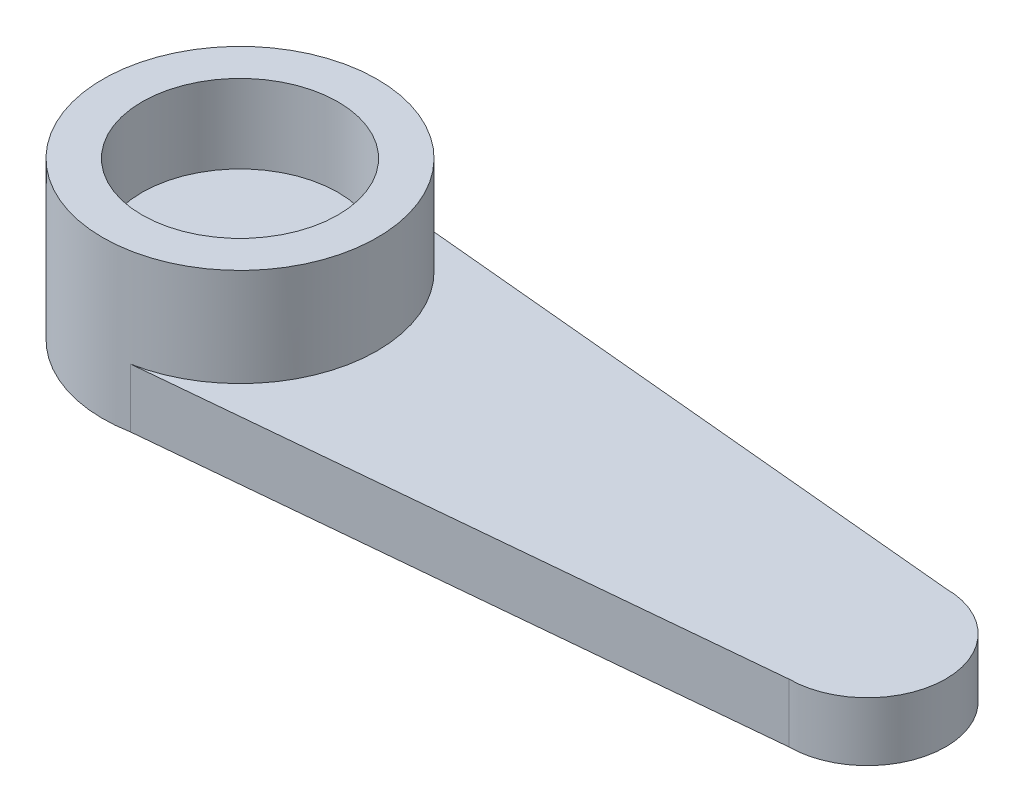
ISO-10303-21;
HEADER;
FILE_DESCRIPTION(('STEP AP214'),'2;1');
FILE_NAME('part.step','',(''),(''),'','','');
FILE_SCHEMA(('AUTOMOTIVE_DESIGN { 1 0 10303 214 1 1 1 1 }'));
ENDSEC;
DATA;
#1=APPLICATION_CONTEXT('core data for automotive mechanical design processes');
#2=APPLICATION_PROTOCOL_DEFINITION('international standard','automotive_design',2000,#1);
#3=PRODUCT_CONTEXT('',#1,'mechanical');
#4=PRODUCT('Part','Part','',(#3));
#5=PRODUCT_RELATED_PRODUCT_CATEGORY('part','',(#4));
#6=PRODUCT_DEFINITION_FORMATION('','',#4);
#7=PRODUCT_DEFINITION_CONTEXT('part definition',#1,'design');
#8=PRODUCT_DEFINITION('design','',#6,#7);
#9=PRODUCT_DEFINITION_SHAPE('','',#8);
#10=(LENGTH_UNIT() NAMED_UNIT(*) SI_UNIT(.MILLI.,.METRE.));
#11=(NAMED_UNIT(*) PLANE_ANGLE_UNIT() SI_UNIT($,.RADIAN.));
#12=(NAMED_UNIT(*) SI_UNIT($,.STERADIAN.) SOLID_ANGLE_UNIT());
#13=UNCERTAINTY_MEASURE_WITH_UNIT(LENGTH_MEASURE(1.E-05),#10,'distance_accuracy_value','');
#14=(GEOMETRIC_REPRESENTATION_CONTEXT(3) GLOBAL_UNCERTAINTY_ASSIGNED_CONTEXT((#13)) GLOBAL_UNIT_ASSIGNED_CONTEXT((#10,
#11,#12)) REPRESENTATION_CONTEXT('',''));
#15=CARTESIAN_POINT('',(0.,0.,0.));
#16=DIRECTION('',(0.,0.,1.));
#17=DIRECTION('',(1.,0.,0.));
#18=AXIS2_PLACEMENT_3D('',#15,#16,#17);
#19=CARTESIAN_POINT('',(0.,4.,0.));
#20=DIRECTION('',(0.,-1.,0.));
#21=DIRECTION('',(0.,0.,-1.));
#22=AXIS2_PLACEMENT_3D('',#19,#20,#21);
#23=CYLINDRICAL_SURFACE('',#22,3.5);
#24=CARTESIAN_POINT('',(0.,1.5,0.));
#25=DIRECTION('',(0.,1.,0.));
#26=DIRECTION('',(0.,0.,1.));
#27=AXIS2_PLACEMENT_3D('',#24,#25,#26);
#28=CIRCLE('',#27,3.5);
#29=CARTESIAN_POINT('',(0.650532429816065,1.5,3.43901258470474));
#30=VERTEX_POINT('',#29);
#31=CARTESIAN_POINT('',(0.650532429816065,1.5,-3.43901258470474));
#32=VERTEX_POINT('',#31);
#33=EDGE_CURVE('E48',#30,#32,#28,.T.);
#34=ORIENTED_EDGE('',*,*,#33,.T.);
#35=DIRECTION('',(0.,-1.,0.));
#36=VECTOR('',#35,1.);
#37=CARTESIAN_POINT('',(0.650532429816065,1.5,-3.43901258470474));
#38=LINE('',#37,#36);
#39=CARTESIAN_POINT('',(0.650532429816065,0.,-3.43901258470474));
#40=VERTEX_POINT('',#39);
#41=EDGE_CURVE('E94',#32,#40,#38,.T.);
#42=ORIENTED_EDGE('',*,*,#41,.T.);
#43=CARTESIAN_POINT('',(0.,0.,0.));
#44=DIRECTION('',(0.,1.,0.));
#45=DIRECTION('',(0.,0.,1.));
#46=AXIS2_PLACEMENT_3D('',#43,#44,#45);
#47=CIRCLE('',#46,3.5);
#48=CARTESIAN_POINT('',(0.650532429816065,0.,3.43901258470474));
#49=VERTEX_POINT('',#48);
#50=EDGE_CURVE('E37',#40,#49,#47,.T.);
#51=ORIENTED_EDGE('',*,*,#50,.T.);
#52=DIRECTION('',(0.,-1.,0.));
#53=VECTOR('',#52,1.);
#54=CARTESIAN_POINT('',(0.650532429816065,1.5,3.43901258470474));
#55=LINE('',#54,#53);
#56=EDGE_CURVE('E53',#30,#49,#55,.T.);
#57=ORIENTED_EDGE('',*,*,#56,.F.);
#58=EDGE_LOOP('',(#34,#42,#51,#57));
#59=FACE_BOUND('',#58,.T.);
#60=CARTESIAN_POINT('',(0.,4.,0.));
#61=DIRECTION('',(0.,1.,0.));
#62=DIRECTION('',(0.,0.,1.));
#63=AXIS2_PLACEMENT_3D('',#60,#61,#62);
#64=CIRCLE('',#63,3.5);
#65=CARTESIAN_POINT('',(0.,4.,3.5));
#66=VERTEX_POINT('',#65);
#67=EDGE_CURVE('E11',#66,#66,#64,.T.);
#68=ORIENTED_EDGE('',*,*,#67,.F.);
#69=EDGE_LOOP('',(#68));
#70=FACE_BOUND('',#69,.T.);
#71=ADVANCED_FACE('F34',(#59,#70),#23,.T.);
#72=CARTESIAN_POINT('',(0.,4.,0.));
#73=DIRECTION('',(0.,1.,0.));
#74=DIRECTION('',(0.,0.,1.));
#75=AXIS2_PLACEMENT_3D('',#72,#73,#74);
#76=PLANE('',#75);
#77=CARTESIAN_POINT('',(0.,4.,0.));
#78=DIRECTION('',(0.,1.,0.));
#79=DIRECTION('',(0.,0.,1.));
#80=AXIS2_PLACEMENT_3D('',#77,#78,#79);
#81=CIRCLE('',#80,2.5);
#82=CARTESIAN_POINT('',(0.,4.,2.5));
#83=VERTEX_POINT('',#82);
#84=EDGE_CURVE('E93',#83,#83,#81,.T.);
#85=ORIENTED_EDGE('',*,*,#84,.F.);
#86=EDGE_LOOP('',(#85));
#87=FACE_BOUND('',#86,.T.);
#88=ORIENTED_EDGE('',*,*,#67,.T.);
#89=EDGE_LOOP('',(#88));
#90=FACE_BOUND('',#89,.T.);
#91=ADVANCED_FACE('F117',(#87,#90),#76,.T.);
#92=CARTESIAN_POINT('',(0.,0.,0.));
#93=DIRECTION('',(0.,1.,0.));
#94=DIRECTION('',(0.,0.,1.));
#95=AXIS2_PLACEMENT_3D('',#92,#93,#94);
#96=PLANE('',#95);
#97=ORIENTED_EDGE('',*,*,#50,.F.);
#98=DIRECTION('',(0.995634226059288,0.,0.0933407086930581));
#99=VECTOR('',#98,1.);
#100=CARTESIAN_POINT('',(0.325266214908034,0.,-3.46950629235237));
#101=LINE('',#100,#99);
#102=CARTESIAN_POINT('',(16.,0.,-2.));
#103=VERTEX_POINT('',#102);
#104=EDGE_CURVE('E103',#40,#103,#101,.T.);
#105=ORIENTED_EDGE('',*,*,#104,.T.);
#106=CARTESIAN_POINT('',(16.,0.,0.));
#107=DIRECTION('',(0.,1.,0.));
#108=DIRECTION('',(0.,0.,1.));
#109=AXIS2_PLACEMENT_3D('',#106,#107,#108);
#110=CIRCLE('',#109,2.);
#111=CARTESIAN_POINT('',(16.,0.,2.));
#112=VERTEX_POINT('',#111);
#113=EDGE_CURVE('E89',#112,#103,#110,.T.);
#114=ORIENTED_EDGE('',*,*,#113,.F.);
#115=DIRECTION('',(0.995634226059288,0.,-0.0933407086930581));
#116=VECTOR('',#115,1.);
#117=CARTESIAN_POINT('',(0.325266214908034,0.,3.46950629235237));
#118=LINE('',#117,#116);
#119=EDGE_CURVE('E83',#49,#112,#118,.T.);
#120=ORIENTED_EDGE('',*,*,#119,.F.);
#121=EDGE_LOOP('',(#97,#105,#114,#120));
#122=FACE_BOUND('',#121,.T.);
#123=ADVANCED_FACE('F120',(#122),#96,.F.);
#124=CARTESIAN_POINT('',(0.,2.,0.));
#125=DIRECTION('',(0.,1.,0.));
#126=DIRECTION('',(0.,0.,1.));
#127=AXIS2_PLACEMENT_3D('',#124,#125,#126);
#128=CYLINDRICAL_SURFACE('',#127,2.5);
#129=CARTESIAN_POINT('',(0.,2.,0.));
#130=DIRECTION('',(0.,1.,0.));
#131=DIRECTION('',(0.,0.,1.));
#132=AXIS2_PLACEMENT_3D('',#129,#130,#131);
#133=CIRCLE('',#132,2.5);
#134=CARTESIAN_POINT('',(0.,2.,2.5));
#135=VERTEX_POINT('',#134);
#136=EDGE_CURVE('E109',#135,#135,#133,.T.);
#137=ORIENTED_EDGE('',*,*,#136,.F.);
#138=EDGE_LOOP('',(#137));
#139=FACE_BOUND('',#138,.T.);
#140=ORIENTED_EDGE('',*,*,#84,.T.);
#141=EDGE_LOOP('',(#140));
#142=FACE_BOUND('',#141,.T.);
#143=ADVANCED_FACE('F115',(#139,#142),#128,.F.);
#144=CARTESIAN_POINT('',(0.,2.,0.));
#145=DIRECTION('',(0.,1.,0.));
#146=DIRECTION('',(0.,0.,1.));
#147=AXIS2_PLACEMENT_3D('',#144,#145,#146);
#148=PLANE('',#147);
#149=ORIENTED_EDGE('',*,*,#136,.T.);
#150=EDGE_LOOP('',(#149));
#151=FACE_BOUND('',#150,.T.);
#152=ADVANCED_FACE('F145',(#151),#148,.T.);
#153=CARTESIAN_POINT('',(16.,1.5,0.));
#154=DIRECTION('',(0.,-1.,0.));
#155=DIRECTION('',(0.,0.,-1.));
#156=AXIS2_PLACEMENT_3D('',#153,#154,#155);
#157=CYLINDRICAL_SURFACE('',#156,2.);
#158=ORIENTED_EDGE('',*,*,#113,.T.);
#159=DIRECTION('',(0.,-1.,0.));
#160=VECTOR('',#159,1.);
#161=CARTESIAN_POINT('',(16.,1.5,-2.));
#162=LINE('',#161,#160);
#163=CARTESIAN_POINT('',(16.,1.5,-2.));
#164=VERTEX_POINT('',#163);
#165=EDGE_CURVE('E86',#164,#103,#162,.T.);
#166=ORIENTED_EDGE('',*,*,#165,.F.);
#167=CARTESIAN_POINT('',(16.,1.5,0.));
#168=DIRECTION('',(0.,1.,0.));
#169=DIRECTION('',(0.,0.,1.));
#170=AXIS2_PLACEMENT_3D('',#167,#168,#169);
#171=CIRCLE('',#170,2.);
#172=CARTESIAN_POINT('',(16.,1.5,2.));
#173=VERTEX_POINT('',#172);
#174=EDGE_CURVE('E74',#173,#164,#171,.T.);
#175=ORIENTED_EDGE('',*,*,#174,.F.);
#176=DIRECTION('',(0.,-1.,0.));
#177=VECTOR('',#176,1.);
#178=CARTESIAN_POINT('',(16.,1.5,2.));
#179=LINE('',#178,#177);
#180=EDGE_CURVE('E101',#173,#112,#179,.T.);
#181=ORIENTED_EDGE('',*,*,#180,.T.);
#182=EDGE_LOOP('',(#158,#166,#175,#181));
#183=FACE_BOUND('',#182,.T.);
#184=ADVANCED_FACE('F87',(#183),#157,.T.);
#185=CARTESIAN_POINT('',(0.325266214908034,1.5,-3.46950629235237));
#186=DIRECTION('',(0.0933407086930581,0.,-0.995634226059288));
#187=DIRECTION('',(-0.995634226059288,0.,-0.0933407086930581));
#188=AXIS2_PLACEMENT_3D('',#185,#186,#187);
#189=PLANE('',#188);
#190=ORIENTED_EDGE('',*,*,#104,.F.);
#191=ORIENTED_EDGE('',*,*,#41,.F.);
#192=DIRECTION('',(0.995634226059288,0.,0.0933407086930581));
#193=VECTOR('',#192,1.);
#194=CARTESIAN_POINT('',(0.325266214908034,1.5,-3.46950629235237));
#195=LINE('',#194,#193);
#196=EDGE_CURVE('E78',#32,#164,#195,.T.);
#197=ORIENTED_EDGE('',*,*,#196,.T.);
#198=ORIENTED_EDGE('',*,*,#165,.T.);
#199=EDGE_LOOP('',(#190,#191,#197,#198));
#200=FACE_BOUND('',#199,.T.);
#201=ADVANCED_FACE('F96',(#200),#189,.T.);
#202=CARTESIAN_POINT('',(0.325266214908034,1.5,3.46950629235237));
#203=DIRECTION('',(-0.0933407086930581,0.,-0.995634226059288));
#204=DIRECTION('',(-0.995634226059288,0.,0.0933407086930581));
#205=AXIS2_PLACEMENT_3D('',#202,#203,#204);
#206=PLANE('',#205);
#207=ORIENTED_EDGE('',*,*,#119,.T.);
#208=ORIENTED_EDGE('',*,*,#180,.F.);
#209=DIRECTION('',(0.995634226059288,0.,-0.0933407086930581));
#210=VECTOR('',#209,1.);
#211=CARTESIAN_POINT('',(0.325266214908034,1.5,3.46950629235237));
#212=LINE('',#211,#210);
#213=EDGE_CURVE('E79',#30,#173,#212,.T.);
#214=ORIENTED_EDGE('',*,*,#213,.F.);
#215=ORIENTED_EDGE('',*,*,#56,.T.);
#216=EDGE_LOOP('',(#207,#208,#214,#215));
#217=FACE_BOUND('',#216,.T.);
#218=ADVANCED_FACE('F164',(#217),#206,.F.);
#219=CARTESIAN_POINT('',(0.,1.5,0.));
#220=DIRECTION('',(0.,1.,0.));
#221=DIRECTION('',(0.,0.,1.));
#222=AXIS2_PLACEMENT_3D('',#219,#220,#221);
#223=PLANE('',#222);
#224=ORIENTED_EDGE('',*,*,#174,.T.);
#225=ORIENTED_EDGE('',*,*,#196,.F.);
#226=ORIENTED_EDGE('',*,*,#33,.F.);
#227=ORIENTED_EDGE('',*,*,#213,.T.);
#228=EDGE_LOOP('',(#224,#225,#226,#227));
#229=FACE_BOUND('',#228,.T.);
#230=ADVANCED_FACE('F76',(#229),#223,.T.);
#231=CLOSED_SHELL('',(#71,#91,#123,#143,#152,#184,#201,#218,#230));
#232=MANIFOLD_SOLID_BREP('B2',#231);
#233=ADVANCED_BREP_SHAPE_REPRESENTATION('',(#18,#232),#14);
#234=SHAPE_DEFINITION_REPRESENTATION(#9,#233);
ENDSEC;
END-ISO-10303-21;
